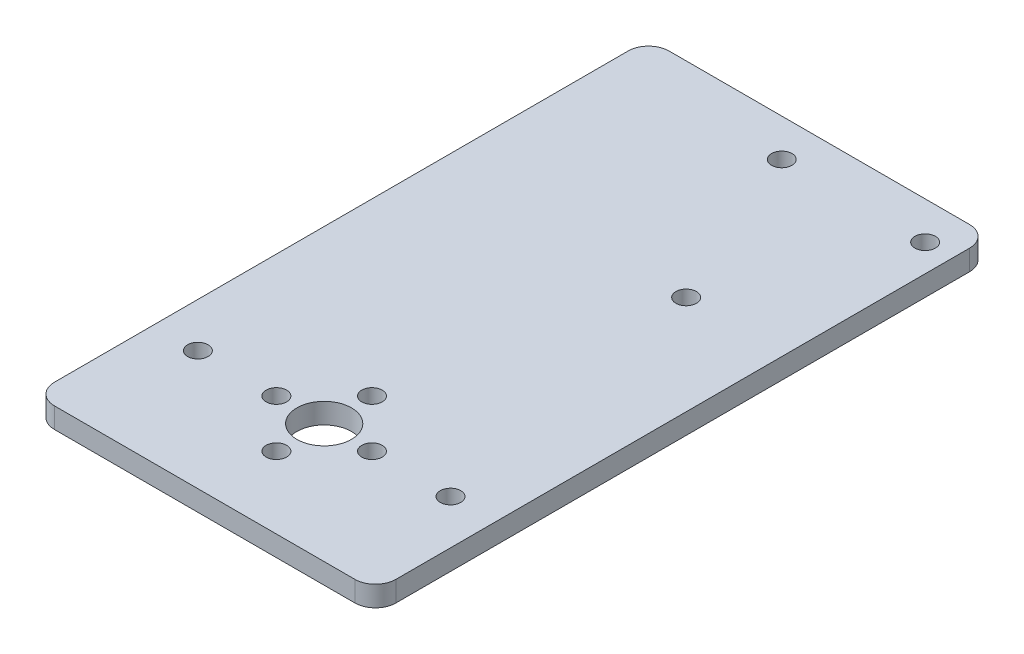
ISO-10303-21;
HEADER;
FILE_DESCRIPTION(('STEP AP214'),'2;1');
FILE_NAME('part.step','',(''),(''),'','','');
FILE_SCHEMA(('AUTOMOTIVE_DESIGN { 1 0 10303 214 1 1 1 1 }'));
ENDSEC;
DATA;
#1=APPLICATION_CONTEXT('core data for automotive mechanical design processes');
#2=APPLICATION_PROTOCOL_DEFINITION('international standard','automotive_design',2000,#1);
#3=PRODUCT_CONTEXT('',#1,'mechanical');
#4=PRODUCT('Part','Part','',(#3));
#5=PRODUCT_RELATED_PRODUCT_CATEGORY('part','',(#4));
#6=PRODUCT_DEFINITION_FORMATION('','',#4);
#7=PRODUCT_DEFINITION_CONTEXT('part definition',#1,'design');
#8=PRODUCT_DEFINITION('design','',#6,#7);
#9=PRODUCT_DEFINITION_SHAPE('','',#8);
#10=(LENGTH_UNIT() NAMED_UNIT(*) SI_UNIT(.MILLI.,.METRE.));
#11=(NAMED_UNIT(*) PLANE_ANGLE_UNIT() SI_UNIT($,.RADIAN.));
#12=(NAMED_UNIT(*) SI_UNIT($,.STERADIAN.) SOLID_ANGLE_UNIT());
#13=UNCERTAINTY_MEASURE_WITH_UNIT(LENGTH_MEASURE(1.E-05),#10,'distance_accuracy_value','');
#14=(GEOMETRIC_REPRESENTATION_CONTEXT(3) GLOBAL_UNCERTAINTY_ASSIGNED_CONTEXT((#13)) GLOBAL_UNIT_ASSIGNED_CONTEXT((#10,
#11,#12)) REPRESENTATION_CONTEXT('',''));
#15=CARTESIAN_POINT('',(0.,0.,0.));
#16=DIRECTION('',(0.,0.,1.));
#17=DIRECTION('',(1.,0.,0.));
#18=AXIS2_PLACEMENT_3D('',#15,#16,#17);
#19=CARTESIAN_POINT('',(0.,3.,0.));
#20=DIRECTION('',(0.,1.,0.));
#21=DIRECTION('',(0.,0.,1.));
#22=AXIS2_PLACEMENT_3D('',#19,#20,#21);
#23=PLANE('',#22);
#24=CARTESIAN_POINT('',(10.5000000000001,3.,-32.5));
#25=DIRECTION('',(0.,1.,0.));
#26=DIRECTION('',(0.,0.,1.));
#27=AXIS2_PLACEMENT_3D('',#24,#25,#26);
#28=CIRCLE('',#27,1.5);
#29=CARTESIAN_POINT('',(10.5000000000001,3.,-31.));
#30=VERTEX_POINT('',#29);
#31=EDGE_CURVE('E267',#30,#30,#28,.T.);
#32=ORIENTED_EDGE('',*,*,#31,.F.);
#33=EDGE_LOOP('',(#32));
#34=FACE_BOUND('',#33,.T.);
#35=CARTESIAN_POINT('',(-6.9999999999998,3.,10.0000000000001));
#36=DIRECTION('',(0.,1.,0.));
#37=DIRECTION('',(0.,0.,1.));
#38=AXIS2_PLACEMENT_3D('',#35,#36,#37);
#39=CIRCLE('',#38,1.5);
#40=CARTESIAN_POINT('',(-6.9999999999998,3.,11.5000000000001));
#41=VERTEX_POINT('',#40);
#42=EDGE_CURVE('E251',#41,#41,#39,.T.);
#43=ORIENTED_EDGE('',*,*,#42,.F.);
#44=EDGE_LOOP('',(#43));
#45=FACE_BOUND('',#44,.T.);
#46=CARTESIAN_POINT('',(7.0000000000002,3.,9.99999999999983));
#47=DIRECTION('',(0.,1.,0.));
#48=DIRECTION('',(0.,0.,1.));
#49=AXIS2_PLACEMENT_3D('',#46,#47,#48);
#50=CIRCLE('',#49,1.5);
#51=CARTESIAN_POINT('',(7.0000000000002,3.,11.4999999999998));
#52=VERTEX_POINT('',#51);
#53=EDGE_CURVE('E235',#52,#52,#50,.T.);
#54=ORIENTED_EDGE('',*,*,#53,.F.);
#55=EDGE_LOOP('',(#54));
#56=FACE_BOUND('',#55,.T.);
#57=CARTESIAN_POINT('',(-18.5,3.,10.));
#58=DIRECTION('',(0.,1.,0.));
#59=DIRECTION('',(0.,0.,1.));
#60=AXIS2_PLACEMENT_3D('',#57,#58,#59);
#61=CIRCLE('',#60,1.5);
#62=CARTESIAN_POINT('',(-18.5,3.,11.5));
#63=VERTEX_POINT('',#62);
#64=EDGE_CURVE('E219',#63,#63,#61,.T.);
#65=ORIENTED_EDGE('',*,*,#64,.F.);
#66=EDGE_LOOP('',(#65));
#67=FACE_BOUND('',#66,.T.);
#68=CARTESIAN_POINT('',(0.,3.,10.));
#69=DIRECTION('',(0.,1.,0.));
#70=DIRECTION('',(0.,0.,1.));
#71=AXIS2_PLACEMENT_3D('',#68,#69,#70);
#72=CIRCLE('',#71,4.);
#73=CARTESIAN_POINT('',(0.,3.,14.));
#74=VERTEX_POINT('',#73);
#75=EDGE_CURVE('E200',#74,#74,#72,.T.);
#76=ORIENTED_EDGE('',*,*,#75,.F.);
#77=EDGE_LOOP('',(#76));
#78=FACE_BOUND('',#77,.T.);
#79=DIRECTION('',(1.,0.,0.));
#80=VECTOR('',#79,1.);
#81=CARTESIAN_POINT('',(25.,3.,27.5));
#82=LINE('',#81,#80);
#83=CARTESIAN_POINT('',(-22.,3.,27.5));
#84=VERTEX_POINT('',#83);
#85=CARTESIAN_POINT('',(22.,3.,27.5));
#86=VERTEX_POINT('',#85);
#87=EDGE_CURVE('E151',#84,#86,#82,.T.);
#88=ORIENTED_EDGE('',*,*,#87,.T.);
#89=CARTESIAN_POINT('',(22.,3.,24.5));
#90=DIRECTION('',(0.,1.,0.));
#91=DIRECTION('',(0.,0.,1.));
#92=AXIS2_PLACEMENT_3D('',#89,#90,#91);
#93=CIRCLE('',#92,3.);
#94=CARTESIAN_POINT('',(25.,3.,24.5));
#95=VERTEX_POINT('',#94);
#96=EDGE_CURVE('E172',#86,#95,#93,.T.);
#97=ORIENTED_EDGE('',*,*,#96,.T.);
#98=DIRECTION('',(0.,0.,-1.));
#99=VECTOR('',#98,1.);
#100=CARTESIAN_POINT('',(25.,3.,-17.5));
#101=LINE('',#100,#99);
#102=CARTESIAN_POINT('',(25.,3.,-59.5));
#103=VERTEX_POINT('',#102);
#104=EDGE_CURVE('E130',#95,#103,#101,.T.);
#105=ORIENTED_EDGE('',*,*,#104,.T.);
#106=CARTESIAN_POINT('',(22.,3.,-59.5));
#107=DIRECTION('',(0.,1.,0.));
#108=DIRECTION('',(0.,0.,1.));
#109=AXIS2_PLACEMENT_3D('',#106,#107,#108);
#110=CIRCLE('',#109,3.);
#111=CARTESIAN_POINT('',(22.,3.,-62.5));
#112=VERTEX_POINT('',#111);
#113=EDGE_CURVE('E166',#103,#112,#110,.T.);
#114=ORIENTED_EDGE('',*,*,#113,.T.);
#115=DIRECTION('',(-1.,0.,0.));
#116=VECTOR('',#115,1.);
#117=CARTESIAN_POINT('',(25.,3.,-62.5));
#118=LINE('',#117,#116);
#119=CARTESIAN_POINT('',(-22.,3.,-62.5));
#120=VERTEX_POINT('',#119);
#121=EDGE_CURVE('E144',#112,#120,#118,.T.);
#122=ORIENTED_EDGE('',*,*,#121,.T.);
#123=CARTESIAN_POINT('',(-22.,3.,-59.5));
#124=DIRECTION('',(0.,1.,0.));
#125=DIRECTION('',(0.,0.,1.));
#126=AXIS2_PLACEMENT_3D('',#123,#124,#125);
#127=CIRCLE('',#126,3.);
#128=CARTESIAN_POINT('',(-25.,3.,-59.5));
#129=VERTEX_POINT('',#128);
#130=EDGE_CURVE('E64',#120,#129,#127,.T.);
#131=ORIENTED_EDGE('',*,*,#130,.T.);
#132=DIRECTION('',(0.,0.,1.));
#133=VECTOR('',#132,1.);
#134=CARTESIAN_POINT('',(-25.,3.,-62.5));
#135=LINE('',#134,#133);
#136=CARTESIAN_POINT('',(-25.,3.,24.5));
#137=VERTEX_POINT('',#136);
#138=EDGE_CURVE('E193',#129,#137,#135,.T.);
#139=ORIENTED_EDGE('',*,*,#138,.T.);
#140=CARTESIAN_POINT('',(-22.,3.,24.5));
#141=DIRECTION('',(0.,1.,0.));
#142=DIRECTION('',(0.,0.,1.));
#143=AXIS2_PLACEMENT_3D('',#140,#141,#142);
#144=CIRCLE('',#143,3.);
#145=EDGE_CURVE('E169',#137,#84,#144,.T.);
#146=ORIENTED_EDGE('',*,*,#145,.T.);
#147=EDGE_LOOP('',(#88,#97,#105,#114,#122,#131,#139,#146));
#148=FACE_BOUND('',#147,.T.);
#149=CARTESIAN_POINT('',(0.,3.,3.));
#150=DIRECTION('',(0.,1.,0.));
#151=DIRECTION('',(0.,0.,1.));
#152=AXIS2_PLACEMENT_3D('',#149,#150,#151);
#153=CIRCLE('',#152,1.5);
#154=CARTESIAN_POINT('',(0.,3.,4.5));
#155=VERTEX_POINT('',#154);
#156=EDGE_CURVE('E211',#155,#155,#153,.T.);
#157=ORIENTED_EDGE('',*,*,#156,.F.);
#158=EDGE_LOOP('',(#157));
#159=FACE_BOUND('',#158,.T.);
#160=CARTESIAN_POINT('',(18.5,3.,10.));
#161=DIRECTION('',(0.,1.,0.));
#162=DIRECTION('',(0.,0.,1.));
#163=AXIS2_PLACEMENT_3D('',#160,#161,#162);
#164=CIRCLE('',#163,1.5);
#165=CARTESIAN_POINT('',(18.5,3.,11.5));
#166=VERTEX_POINT('',#165);
#167=EDGE_CURVE('E227',#166,#166,#164,.T.);
#168=ORIENTED_EDGE('',*,*,#167,.F.);
#169=EDGE_LOOP('',(#168));
#170=FACE_BOUND('',#169,.T.);
#171=CARTESIAN_POINT('',(3.46818829043387E-13,3.,17.));
#172=DIRECTION('',(0.,1.,0.));
#173=DIRECTION('',(0.,0.,1.));
#174=AXIS2_PLACEMENT_3D('',#171,#172,#173);
#175=CIRCLE('',#174,1.5);
#176=CARTESIAN_POINT('',(3.46818829043387E-13,3.,18.5));
#177=VERTEX_POINT('',#176);
#178=EDGE_CURVE('E243',#177,#177,#175,.T.);
#179=ORIENTED_EDGE('',*,*,#178,.F.);
#180=EDGE_LOOP('',(#179));
#181=FACE_BOUND('',#180,.T.);
#182=CARTESIAN_POINT('',(0.,3.,-57.));
#183=DIRECTION('',(0.,1.,0.));
#184=DIRECTION('',(0.,0.,1.));
#185=AXIS2_PLACEMENT_3D('',#182,#183,#184);
#186=CIRCLE('',#185,1.5);
#187=CARTESIAN_POINT('',(0.,3.,-55.5));
#188=VERTEX_POINT('',#187);
#189=EDGE_CURVE('E259',#188,#188,#186,.T.);
#190=ORIENTED_EDGE('',*,*,#189,.F.);
#191=EDGE_LOOP('',(#190));
#192=FACE_BOUND('',#191,.T.);
#193=CARTESIAN_POINT('',(21.0000000000001,3.,-57.));
#194=DIRECTION('',(0.,1.,0.));
#195=DIRECTION('',(0.,0.,1.));
#196=AXIS2_PLACEMENT_3D('',#193,#194,#195);
#197=CIRCLE('',#196,1.5);
#198=CARTESIAN_POINT('',(21.0000000000001,3.,-55.5));
#199=VERTEX_POINT('',#198);
#200=EDGE_CURVE('E275',#199,#199,#197,.T.);
#201=ORIENTED_EDGE('',*,*,#200,.F.);
#202=EDGE_LOOP('',(#201));
#203=FACE_BOUND('',#202,.T.);
#204=ADVANCED_FACE('F41',(#34,#45,#56,#67,#78,#148,#159,#170,#181,#192,#203),#23,.T.);
#205=CARTESIAN_POINT('',(0.,0.,0.));
#206=DIRECTION('',(0.,1.,0.));
#207=DIRECTION('',(0.,0.,1.));
#208=AXIS2_PLACEMENT_3D('',#205,#206,#207);
#209=PLANE('',#208);
#210=DIRECTION('',(0.,0.,-1.));
#211=VECTOR('',#210,1.);
#212=CARTESIAN_POINT('',(25.,0.,-17.5));
#213=LINE('',#212,#211);
#214=CARTESIAN_POINT('',(25.,0.,24.5));
#215=VERTEX_POINT('',#214);
#216=CARTESIAN_POINT('',(25.,0.,-59.5));
#217=VERTEX_POINT('',#216);
#218=EDGE_CURVE('E127',#215,#217,#213,.T.);
#219=ORIENTED_EDGE('',*,*,#218,.F.);
#220=CARTESIAN_POINT('',(22.,0.,24.5));
#221=DIRECTION('',(0.,1.,0.));
#222=DIRECTION('',(0.,0.,1.));
#223=AXIS2_PLACEMENT_3D('',#220,#221,#222);
#224=CIRCLE('',#223,3.);
#225=CARTESIAN_POINT('',(22.,0.,27.5));
#226=VERTEX_POINT('',#225);
#227=EDGE_CURVE('E109',#215,#226,#224,.F.);
#228=ORIENTED_EDGE('',*,*,#227,.T.);
#229=DIRECTION('',(1.,0.,0.));
#230=VECTOR('',#229,1.);
#231=CARTESIAN_POINT('',(25.,0.,27.5));
#232=LINE('',#231,#230);
#233=CARTESIAN_POINT('',(-22.,0.,27.5));
#234=VERTEX_POINT('',#233);
#235=EDGE_CURVE('E140',#234,#226,#232,.T.);
#236=ORIENTED_EDGE('',*,*,#235,.F.);
#237=CARTESIAN_POINT('',(-22.,0.,24.5));
#238=DIRECTION('',(0.,1.,0.));
#239=DIRECTION('',(0.,0.,1.));
#240=AXIS2_PLACEMENT_3D('',#237,#238,#239);
#241=CIRCLE('',#240,3.);
#242=CARTESIAN_POINT('',(-25.,0.,24.5));
#243=VERTEX_POINT('',#242);
#244=EDGE_CURVE('E121',#234,#243,#241,.F.);
#245=ORIENTED_EDGE('',*,*,#244,.T.);
#246=DIRECTION('',(0.,0.,1.));
#247=VECTOR('',#246,1.);
#248=CARTESIAN_POINT('',(-25.,0.,-17.5));
#249=LINE('',#248,#247);
#250=CARTESIAN_POINT('',(-25.,0.,-59.5));
#251=VERTEX_POINT('',#250);
#252=EDGE_CURVE('E146',#251,#243,#249,.T.);
#253=ORIENTED_EDGE('',*,*,#252,.F.);
#254=CARTESIAN_POINT('',(-22.,0.,-59.5));
#255=DIRECTION('',(0.,1.,0.));
#256=DIRECTION('',(0.,0.,1.));
#257=AXIS2_PLACEMENT_3D('',#254,#255,#256);
#258=CIRCLE('',#257,3.);
#259=CARTESIAN_POINT('',(-22.,0.,-62.5));
#260=VERTEX_POINT('',#259);
#261=EDGE_CURVE('E132',#251,#260,#258,.F.);
#262=ORIENTED_EDGE('',*,*,#261,.T.);
#263=DIRECTION('',(-1.,0.,0.));
#264=VECTOR('',#263,1.);
#265=CARTESIAN_POINT('',(25.,0.,-62.5));
#266=LINE('',#265,#264);
#267=CARTESIAN_POINT('',(22.,0.,-62.5));
#268=VERTEX_POINT('',#267);
#269=EDGE_CURVE('E187',#268,#260,#266,.T.);
#270=ORIENTED_EDGE('',*,*,#269,.F.);
#271=CARTESIAN_POINT('',(22.,0.,-59.5));
#272=DIRECTION('',(0.,1.,0.));
#273=DIRECTION('',(0.,0.,1.));
#274=AXIS2_PLACEMENT_3D('',#271,#272,#273);
#275=CIRCLE('',#274,3.);
#276=EDGE_CURVE('E138',#268,#217,#275,.F.);
#277=ORIENTED_EDGE('',*,*,#276,.T.);
#278=EDGE_LOOP('',(#219,#228,#236,#245,#253,#262,#270,#277));
#279=FACE_BOUND('',#278,.T.);
#280=CARTESIAN_POINT('',(0.,0.,10.));
#281=DIRECTION('',(0.,1.,0.));
#282=DIRECTION('',(0.,0.,1.));
#283=AXIS2_PLACEMENT_3D('',#280,#281,#282);
#284=CIRCLE('',#283,4.);
#285=CARTESIAN_POINT('',(0.,0.,14.));
#286=VERTEX_POINT('',#285);
#287=EDGE_CURVE('E207',#286,#286,#284,.T.);
#288=ORIENTED_EDGE('',*,*,#287,.T.);
#289=EDGE_LOOP('',(#288));
#290=FACE_BOUND('',#289,.T.);
#291=CARTESIAN_POINT('',(0.,0.,3.));
#292=DIRECTION('',(0.,1.,0.));
#293=DIRECTION('',(0.,0.,1.));
#294=AXIS2_PLACEMENT_3D('',#291,#292,#293);
#295=CIRCLE('',#294,1.5);
#296=CARTESIAN_POINT('',(0.,0.,4.5));
#297=VERTEX_POINT('',#296);
#298=EDGE_CURVE('E215',#297,#297,#295,.T.);
#299=ORIENTED_EDGE('',*,*,#298,.T.);
#300=EDGE_LOOP('',(#299));
#301=FACE_BOUND('',#300,.T.);
#302=CARTESIAN_POINT('',(-18.5,0.,10.));
#303=DIRECTION('',(0.,1.,0.));
#304=DIRECTION('',(0.,0.,1.));
#305=AXIS2_PLACEMENT_3D('',#302,#303,#304);
#306=CIRCLE('',#305,1.5);
#307=CARTESIAN_POINT('',(-18.5,0.,11.5));
#308=VERTEX_POINT('',#307);
#309=EDGE_CURVE('E223',#308,#308,#306,.T.);
#310=ORIENTED_EDGE('',*,*,#309,.T.);
#311=EDGE_LOOP('',(#310));
#312=FACE_BOUND('',#311,.T.);
#313=CARTESIAN_POINT('',(18.5,0.,10.));
#314=DIRECTION('',(0.,1.,0.));
#315=DIRECTION('',(0.,0.,1.));
#316=AXIS2_PLACEMENT_3D('',#313,#314,#315);
#317=CIRCLE('',#316,1.5);
#318=CARTESIAN_POINT('',(18.5,0.,11.5));
#319=VERTEX_POINT('',#318);
#320=EDGE_CURVE('E231',#319,#319,#317,.T.);
#321=ORIENTED_EDGE('',*,*,#320,.T.);
#322=EDGE_LOOP('',(#321));
#323=FACE_BOUND('',#322,.T.);
#324=CARTESIAN_POINT('',(7.0000000000002,0.,9.99999999999983));
#325=DIRECTION('',(0.,1.,0.));
#326=DIRECTION('',(0.,0.,1.));
#327=AXIS2_PLACEMENT_3D('',#324,#325,#326);
#328=CIRCLE('',#327,1.5);
#329=CARTESIAN_POINT('',(7.0000000000002,0.,11.4999999999998));
#330=VERTEX_POINT('',#329);
#331=EDGE_CURVE('E239',#330,#330,#328,.T.);
#332=ORIENTED_EDGE('',*,*,#331,.T.);
#333=EDGE_LOOP('',(#332));
#334=FACE_BOUND('',#333,.T.);
#335=CARTESIAN_POINT('',(3.46818829043387E-13,0.,17.));
#336=DIRECTION('',(0.,1.,0.));
#337=DIRECTION('',(0.,0.,1.));
#338=AXIS2_PLACEMENT_3D('',#335,#336,#337);
#339=CIRCLE('',#338,1.5);
#340=CARTESIAN_POINT('',(3.46818829043387E-13,0.,18.5));
#341=VERTEX_POINT('',#340);
#342=EDGE_CURVE('E247',#341,#341,#339,.T.);
#343=ORIENTED_EDGE('',*,*,#342,.T.);
#344=EDGE_LOOP('',(#343));
#345=FACE_BOUND('',#344,.T.);
#346=CARTESIAN_POINT('',(-6.9999999999998,0.,10.0000000000001));
#347=DIRECTION('',(0.,1.,0.));
#348=DIRECTION('',(0.,0.,1.));
#349=AXIS2_PLACEMENT_3D('',#346,#347,#348);
#350=CIRCLE('',#349,1.5);
#351=CARTESIAN_POINT('',(-6.9999999999998,0.,11.5000000000001));
#352=VERTEX_POINT('',#351);
#353=EDGE_CURVE('E255',#352,#352,#350,.T.);
#354=ORIENTED_EDGE('',*,*,#353,.T.);
#355=EDGE_LOOP('',(#354));
#356=FACE_BOUND('',#355,.T.);
#357=CARTESIAN_POINT('',(0.,0.,-57.));
#358=DIRECTION('',(0.,1.,0.));
#359=DIRECTION('',(0.,0.,1.));
#360=AXIS2_PLACEMENT_3D('',#357,#358,#359);
#361=CIRCLE('',#360,1.5);
#362=CARTESIAN_POINT('',(0.,0.,-55.5));
#363=VERTEX_POINT('',#362);
#364=EDGE_CURVE('E263',#363,#363,#361,.T.);
#365=ORIENTED_EDGE('',*,*,#364,.T.);
#366=EDGE_LOOP('',(#365));
#367=FACE_BOUND('',#366,.T.);
#368=CARTESIAN_POINT('',(10.5000000000001,0.,-32.5));
#369=DIRECTION('',(0.,1.,0.));
#370=DIRECTION('',(0.,0.,1.));
#371=AXIS2_PLACEMENT_3D('',#368,#369,#370);
#372=CIRCLE('',#371,1.5);
#373=CARTESIAN_POINT('',(10.5000000000001,0.,-31.));
#374=VERTEX_POINT('',#373);
#375=EDGE_CURVE('E271',#374,#374,#372,.T.);
#376=ORIENTED_EDGE('',*,*,#375,.T.);
#377=EDGE_LOOP('',(#376));
#378=FACE_BOUND('',#377,.T.);
#379=CARTESIAN_POINT('',(21.0000000000001,0.,-57.));
#380=DIRECTION('',(0.,1.,0.));
#381=DIRECTION('',(0.,0.,1.));
#382=AXIS2_PLACEMENT_3D('',#379,#380,#381);
#383=CIRCLE('',#382,1.5);
#384=CARTESIAN_POINT('',(21.0000000000001,0.,-55.5));
#385=VERTEX_POINT('',#384);
#386=EDGE_CURVE('E279',#385,#385,#383,.T.);
#387=ORIENTED_EDGE('',*,*,#386,.T.);
#388=EDGE_LOOP('',(#387));
#389=FACE_BOUND('',#388,.T.);
#390=ADVANCED_FACE('F135',(#279,#290,#301,#312,#323,#334,#345,#356,#367,#378,#389),#209,.F.);
#391=CARTESIAN_POINT('',(25.,3.,-62.5));
#392=DIRECTION('',(0.,0.,1.));
#393=DIRECTION('',(1.,0.,0.));
#394=AXIS2_PLACEMENT_3D('',#391,#392,#393);
#395=PLANE('',#394);
#396=ORIENTED_EDGE('',*,*,#121,.F.);
#397=DIRECTION('',(0.,-1.,0.));
#398=VECTOR('',#397,1.);
#399=CARTESIAN_POINT('',(22.,3.,-62.5));
#400=LINE('',#399,#398);
#401=EDGE_CURVE('E11',#112,#268,#400,.T.);
#402=ORIENTED_EDGE('',*,*,#401,.T.);
#403=ORIENTED_EDGE('',*,*,#269,.T.);
#404=DIRECTION('',(0.,-1.,0.));
#405=VECTOR('',#404,1.);
#406=CARTESIAN_POINT('',(-22.,3.,-62.5));
#407=LINE('',#406,#405);
#408=EDGE_CURVE('E50',#260,#120,#407,.F.);
#409=ORIENTED_EDGE('',*,*,#408,.T.);
#410=EDGE_LOOP('',(#396,#402,#403,#409));
#411=FACE_BOUND('',#410,.T.);
#412=ADVANCED_FACE('F185',(#411),#395,.F.);
#413=CARTESIAN_POINT('',(-25.,3.,-17.5));
#414=DIRECTION('',(1.,0.,0.));
#415=DIRECTION('',(0.,0.,-1.));
#416=AXIS2_PLACEMENT_3D('',#413,#414,#415);
#417=PLANE('',#416);
#418=ORIENTED_EDGE('',*,*,#252,.T.);
#419=DIRECTION('',(0.,-1.,0.));
#420=VECTOR('',#419,1.);
#421=CARTESIAN_POINT('',(-25.,3.,24.5));
#422=LINE('',#421,#420);
#423=EDGE_CURVE('E57',#243,#137,#422,.F.);
#424=ORIENTED_EDGE('',*,*,#423,.T.);
#425=ORIENTED_EDGE('',*,*,#138,.F.);
#426=DIRECTION('',(0.,-1.,0.));
#427=VECTOR('',#426,1.);
#428=CARTESIAN_POINT('',(-25.,3.,-59.5));
#429=LINE('',#428,#427);
#430=EDGE_CURVE('E175',#129,#251,#429,.T.);
#431=ORIENTED_EDGE('',*,*,#430,.T.);
#432=EDGE_LOOP('',(#418,#424,#425,#431));
#433=FACE_BOUND('',#432,.T.);
#434=ADVANCED_FACE('F197',(#433),#417,.F.);
#435=CARTESIAN_POINT('',(25.,3.,27.5));
#436=DIRECTION('',(0.,0.,-1.));
#437=DIRECTION('',(-1.,0.,0.));
#438=AXIS2_PLACEMENT_3D('',#435,#436,#437);
#439=PLANE('',#438);
#440=ORIENTED_EDGE('',*,*,#235,.T.);
#441=DIRECTION('',(0.,-1.,0.));
#442=VECTOR('',#441,1.);
#443=CARTESIAN_POINT('',(22.,3.,27.5));
#444=LINE('',#443,#442);
#445=EDGE_CURVE('E114',#226,#86,#444,.F.);
#446=ORIENTED_EDGE('',*,*,#445,.T.);
#447=ORIENTED_EDGE('',*,*,#87,.F.);
#448=DIRECTION('',(0.,-1.,0.));
#449=VECTOR('',#448,1.);
#450=CARTESIAN_POINT('',(-22.,3.,27.5));
#451=LINE('',#450,#449);
#452=EDGE_CURVE('E120',#84,#234,#451,.T.);
#453=ORIENTED_EDGE('',*,*,#452,.T.);
#454=EDGE_LOOP('',(#440,#446,#447,#453));
#455=FACE_BOUND('',#454,.T.);
#456=ADVANCED_FACE('F305',(#455),#439,.F.);
#457=CARTESIAN_POINT('',(25.,3.,-17.5));
#458=DIRECTION('',(-1.,0.,0.));
#459=DIRECTION('',(0.,0.,1.));
#460=AXIS2_PLACEMENT_3D('',#457,#458,#459);
#461=PLANE('',#460);
#462=ORIENTED_EDGE('',*,*,#104,.F.);
#463=DIRECTION('',(0.,-1.,0.));
#464=VECTOR('',#463,1.);
#465=CARTESIAN_POINT('',(25.,3.,24.5));
#466=LINE('',#465,#464);
#467=EDGE_CURVE('E113',#95,#215,#466,.T.);
#468=ORIENTED_EDGE('',*,*,#467,.T.);
#469=ORIENTED_EDGE('',*,*,#218,.T.);
#470=DIRECTION('',(0.,-1.,0.));
#471=VECTOR('',#470,1.);
#472=CARTESIAN_POINT('',(25.,3.,-59.5));
#473=LINE('',#472,#471);
#474=EDGE_CURVE('E133',#217,#103,#473,.F.);
#475=ORIENTED_EDGE('',*,*,#474,.T.);
#476=EDGE_LOOP('',(#462,#468,#469,#475));
#477=FACE_BOUND('',#476,.T.);
#478=ADVANCED_FACE('F126',(#477),#461,.F.);
#479=CARTESIAN_POINT('',(0.,3.,10.));
#480=DIRECTION('',(0.,-1.,0.));
#481=DIRECTION('',(0.,0.,-1.));
#482=AXIS2_PLACEMENT_3D('',#479,#480,#481);
#483=CYLINDRICAL_SURFACE('',#482,4.);
#484=ORIENTED_EDGE('',*,*,#75,.T.);
#485=EDGE_LOOP('',(#484));
#486=FACE_BOUND('',#485,.T.);
#487=ORIENTED_EDGE('',*,*,#287,.F.);
#488=EDGE_LOOP('',(#487));
#489=FACE_BOUND('',#488,.T.);
#490=ADVANCED_FACE('F300',(#486,#489),#483,.F.);
#491=CARTESIAN_POINT('',(0.,3.,3.));
#492=DIRECTION('',(0.,-1.,0.));
#493=DIRECTION('',(0.,0.,-1.));
#494=AXIS2_PLACEMENT_3D('',#491,#492,#493);
#495=CYLINDRICAL_SURFACE('',#494,1.5);
#496=ORIENTED_EDGE('',*,*,#156,.T.);
#497=EDGE_LOOP('',(#496));
#498=FACE_BOUND('',#497,.T.);
#499=ORIENTED_EDGE('',*,*,#298,.F.);
#500=EDGE_LOOP('',(#499));
#501=FACE_BOUND('',#500,.T.);
#502=ADVANCED_FACE('F461',(#498,#501),#495,.F.);
#503=CARTESIAN_POINT('',(-18.5,3.,10.));
#504=DIRECTION('',(0.,-1.,0.));
#505=DIRECTION('',(0.,0.,-1.));
#506=AXIS2_PLACEMENT_3D('',#503,#504,#505);
#507=CYLINDRICAL_SURFACE('',#506,1.5);
#508=ORIENTED_EDGE('',*,*,#64,.T.);
#509=EDGE_LOOP('',(#508));
#510=FACE_BOUND('',#509,.T.);
#511=ORIENTED_EDGE('',*,*,#309,.F.);
#512=EDGE_LOOP('',(#511));
#513=FACE_BOUND('',#512,.T.);
#514=ADVANCED_FACE('F451',(#510,#513),#507,.F.);
#515=CARTESIAN_POINT('',(18.5,3.,10.));
#516=DIRECTION('',(0.,-1.,0.));
#517=DIRECTION('',(0.,0.,-1.));
#518=AXIS2_PLACEMENT_3D('',#515,#516,#517);
#519=CYLINDRICAL_SURFACE('',#518,1.5);
#520=ORIENTED_EDGE('',*,*,#167,.T.);
#521=EDGE_LOOP('',(#520));
#522=FACE_BOUND('',#521,.T.);
#523=ORIENTED_EDGE('',*,*,#320,.F.);
#524=EDGE_LOOP('',(#523));
#525=FACE_BOUND('',#524,.T.);
#526=ADVANCED_FACE('F441',(#522,#525),#519,.F.);
#527=CARTESIAN_POINT('',(7.0000000000002,3.,9.99999999999983));
#528=DIRECTION('',(0.,-1.,0.));
#529=DIRECTION('',(0.,0.,-1.));
#530=AXIS2_PLACEMENT_3D('',#527,#528,#529);
#531=CYLINDRICAL_SURFACE('',#530,1.5);
#532=ORIENTED_EDGE('',*,*,#53,.T.);
#533=EDGE_LOOP('',(#532));
#534=FACE_BOUND('',#533,.T.);
#535=ORIENTED_EDGE('',*,*,#331,.F.);
#536=EDGE_LOOP('',(#535));
#537=FACE_BOUND('',#536,.T.);
#538=ADVANCED_FACE('F431',(#534,#537),#531,.F.);
#539=CARTESIAN_POINT('',(3.46818829043387E-13,3.,17.));
#540=DIRECTION('',(0.,-1.,0.));
#541=DIRECTION('',(0.,0.,-1.));
#542=AXIS2_PLACEMENT_3D('',#539,#540,#541);
#543=CYLINDRICAL_SURFACE('',#542,1.5);
#544=ORIENTED_EDGE('',*,*,#178,.T.);
#545=EDGE_LOOP('',(#544));
#546=FACE_BOUND('',#545,.T.);
#547=ORIENTED_EDGE('',*,*,#342,.F.);
#548=EDGE_LOOP('',(#547));
#549=FACE_BOUND('',#548,.T.);
#550=ADVANCED_FACE('F421',(#546,#549),#543,.F.);
#551=CARTESIAN_POINT('',(-6.9999999999998,3.,10.0000000000001));
#552=DIRECTION('',(0.,-1.,0.));
#553=DIRECTION('',(0.,0.,-1.));
#554=AXIS2_PLACEMENT_3D('',#551,#552,#553);
#555=CYLINDRICAL_SURFACE('',#554,1.5);
#556=ORIENTED_EDGE('',*,*,#42,.T.);
#557=EDGE_LOOP('',(#556));
#558=FACE_BOUND('',#557,.T.);
#559=ORIENTED_EDGE('',*,*,#353,.F.);
#560=EDGE_LOOP('',(#559));
#561=FACE_BOUND('',#560,.T.);
#562=ADVANCED_FACE('F411',(#558,#561),#555,.F.);
#563=CARTESIAN_POINT('',(0.,3.,-57.));
#564=DIRECTION('',(0.,-1.,0.));
#565=DIRECTION('',(0.,0.,-1.));
#566=AXIS2_PLACEMENT_3D('',#563,#564,#565);
#567=CYLINDRICAL_SURFACE('',#566,1.5);
#568=ORIENTED_EDGE('',*,*,#189,.T.);
#569=EDGE_LOOP('',(#568));
#570=FACE_BOUND('',#569,.T.);
#571=ORIENTED_EDGE('',*,*,#364,.F.);
#572=EDGE_LOOP('',(#571));
#573=FACE_BOUND('',#572,.T.);
#574=ADVANCED_FACE('F401',(#570,#573),#567,.F.);
#575=CARTESIAN_POINT('',(10.5000000000001,3.,-32.5));
#576=DIRECTION('',(0.,-1.,0.));
#577=DIRECTION('',(0.,0.,-1.));
#578=AXIS2_PLACEMENT_3D('',#575,#576,#577);
#579=CYLINDRICAL_SURFACE('',#578,1.5);
#580=ORIENTED_EDGE('',*,*,#31,.T.);
#581=EDGE_LOOP('',(#580));
#582=FACE_BOUND('',#581,.T.);
#583=ORIENTED_EDGE('',*,*,#375,.F.);
#584=EDGE_LOOP('',(#583));
#585=FACE_BOUND('',#584,.T.);
#586=ADVANCED_FACE('F392',(#582,#585),#579,.F.);
#587=CARTESIAN_POINT('',(21.0000000000001,3.,-57.));
#588=DIRECTION('',(0.,-1.,0.));
#589=DIRECTION('',(0.,0.,-1.));
#590=AXIS2_PLACEMENT_3D('',#587,#588,#589);
#591=CYLINDRICAL_SURFACE('',#590,1.5);
#592=ORIENTED_EDGE('',*,*,#200,.T.);
#593=EDGE_LOOP('',(#592));
#594=FACE_BOUND('',#593,.T.);
#595=ORIENTED_EDGE('',*,*,#386,.F.);
#596=EDGE_LOOP('',(#595));
#597=FACE_BOUND('',#596,.T.);
#598=ADVANCED_FACE('F287',(#594,#597),#591,.F.);
#599=CARTESIAN_POINT('',(22.,3.,24.5));
#600=DIRECTION('',(0.,-1.,0.));
#601=DIRECTION('',(0.,0.,-1.));
#602=AXIS2_PLACEMENT_3D('',#599,#600,#601);
#603=CYLINDRICAL_SURFACE('',#602,3.);
#604=ORIENTED_EDGE('',*,*,#96,.F.);
#605=ORIENTED_EDGE('',*,*,#445,.F.);
#606=ORIENTED_EDGE('',*,*,#227,.F.);
#607=ORIENTED_EDGE('',*,*,#467,.F.);
#608=EDGE_LOOP('',(#604,#605,#606,#607));
#609=FACE_BOUND('',#608,.T.);
#610=ADVANCED_FACE('F112',(#609),#603,.T.);
#611=CARTESIAN_POINT('',(-22.,3.,24.5));
#612=DIRECTION('',(0.,-1.,0.));
#613=DIRECTION('',(0.,0.,-1.));
#614=AXIS2_PLACEMENT_3D('',#611,#612,#613);
#615=CYLINDRICAL_SURFACE('',#614,3.);
#616=ORIENTED_EDGE('',*,*,#145,.F.);
#617=ORIENTED_EDGE('',*,*,#423,.F.);
#618=ORIENTED_EDGE('',*,*,#244,.F.);
#619=ORIENTED_EDGE('',*,*,#452,.F.);
#620=EDGE_LOOP('',(#616,#617,#618,#619));
#621=FACE_BOUND('',#620,.T.);
#622=ADVANCED_FACE('F315',(#621),#615,.T.);
#623=CARTESIAN_POINT('',(22.,3.,-59.5));
#624=DIRECTION('',(0.,-1.,0.));
#625=DIRECTION('',(0.,0.,-1.));
#626=AXIS2_PLACEMENT_3D('',#623,#624,#625);
#627=CYLINDRICAL_SURFACE('',#626,3.);
#628=ORIENTED_EDGE('',*,*,#113,.F.);
#629=ORIENTED_EDGE('',*,*,#474,.F.);
#630=ORIENTED_EDGE('',*,*,#276,.F.);
#631=ORIENTED_EDGE('',*,*,#401,.F.);
#632=EDGE_LOOP('',(#628,#629,#630,#631));
#633=FACE_BOUND('',#632,.T.);
#634=ADVANCED_FACE('F317',(#633),#627,.T.);
#635=CARTESIAN_POINT('',(-22.,3.,-59.5));
#636=DIRECTION('',(0.,-1.,0.));
#637=DIRECTION('',(0.,0.,-1.));
#638=AXIS2_PLACEMENT_3D('',#635,#636,#637);
#639=CYLINDRICAL_SURFACE('',#638,3.);
#640=ORIENTED_EDGE('',*,*,#130,.F.);
#641=ORIENTED_EDGE('',*,*,#408,.F.);
#642=ORIENTED_EDGE('',*,*,#261,.F.);
#643=ORIENTED_EDGE('',*,*,#430,.F.);
#644=EDGE_LOOP('',(#640,#641,#642,#643));
#645=FACE_BOUND('',#644,.T.);
#646=ADVANCED_FACE('F43',(#645),#639,.T.);
#647=CLOSED_SHELL('',(#204,#390,#412,#434,#456,#478,#490,#502,#514,#526,#538,#550,#562,#574,
#586,#598,#610,#622,#634,#646));
#648=MANIFOLD_SOLID_BREP('B2',#647);
#649=ADVANCED_BREP_SHAPE_REPRESENTATION('',(#18,#648),#14);
#650=SHAPE_DEFINITION_REPRESENTATION(#9,#649);
ENDSEC;
END-ISO-10303-21;
